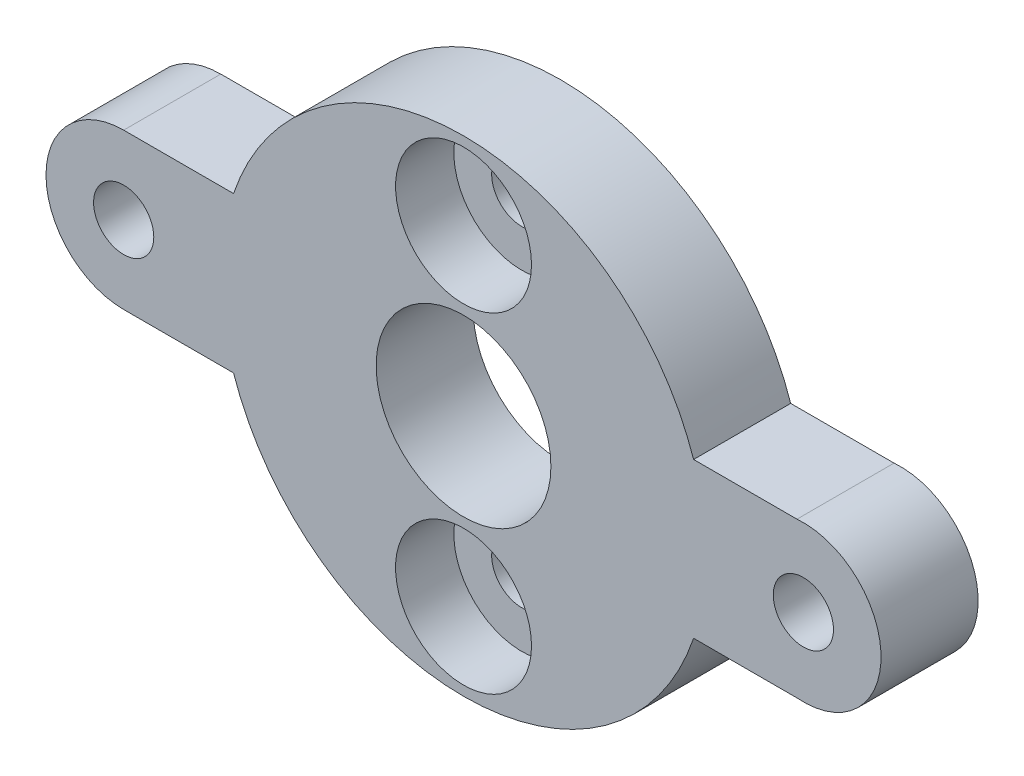
ISO-10303-21;
HEADER;
FILE_DESCRIPTION(('STEP AP214'),'2;1');
FILE_NAME('part.step','',(''),(''),'','','');
FILE_SCHEMA(('AUTOMOTIVE_DESIGN { 1 0 10303 214 1 1 1 1 }'));
ENDSEC;
DATA;
#1=APPLICATION_CONTEXT('core data for automotive mechanical design processes');
#2=APPLICATION_PROTOCOL_DEFINITION('international standard','automotive_design',2000,#1);
#3=PRODUCT_CONTEXT('',#1,'mechanical');
#4=PRODUCT('Part','Part','',(#3));
#5=PRODUCT_RELATED_PRODUCT_CATEGORY('part','',(#4));
#6=PRODUCT_DEFINITION_FORMATION('','',#4);
#7=PRODUCT_DEFINITION_CONTEXT('part definition',#1,'design');
#8=PRODUCT_DEFINITION('design','',#6,#7);
#9=PRODUCT_DEFINITION_SHAPE('','',#8);
#10=(LENGTH_UNIT() NAMED_UNIT(*) SI_UNIT(.MILLI.,.METRE.));
#11=(NAMED_UNIT(*) PLANE_ANGLE_UNIT() SI_UNIT($,.RADIAN.));
#12=(NAMED_UNIT(*) SI_UNIT($,.STERADIAN.) SOLID_ANGLE_UNIT());
#13=UNCERTAINTY_MEASURE_WITH_UNIT(LENGTH_MEASURE(1.E-05),#10,'distance_accuracy_value','');
#14=(GEOMETRIC_REPRESENTATION_CONTEXT(3) GLOBAL_UNCERTAINTY_ASSIGNED_CONTEXT((#13)) GLOBAL_UNIT_ASSIGNED_CONTEXT((#10,
#11,#12)) REPRESENTATION_CONTEXT('',''));
#15=CARTESIAN_POINT('',(0.,0.,0.));
#16=DIRECTION('',(0.,0.,1.));
#17=DIRECTION('',(1.,0.,0.));
#18=AXIS2_PLACEMENT_3D('',#15,#16,#17);
#19=CARTESIAN_POINT('',(0.,8.5,5.));
#20=DIRECTION('',(0.,0.,-1.));
#21=DIRECTION('',(-1.,0.,0.));
#22=AXIS2_PLACEMENT_3D('',#19,#20,#21);
#23=CYLINDRICAL_SURFACE('',#22,1.55);
#24=CARTESIAN_POINT('',(0.,8.5,0.));
#25=DIRECTION('',(0.,0.,1.));
#26=DIRECTION('',(1.,0.,0.));
#27=AXIS2_PLACEMENT_3D('',#24,#25,#26);
#28=CIRCLE('',#27,1.55);
#29=CARTESIAN_POINT('',(1.55,8.5,0.));
#30=VERTEX_POINT('',#29);
#31=EDGE_CURVE('E214',#30,#30,#28,.T.);
#32=ORIENTED_EDGE('',*,*,#31,.F.);
#33=EDGE_LOOP('',(#32));
#34=FACE_BOUND('',#33,.T.);
#35=CARTESIAN_POINT('',(0.,8.5,2.));
#36=DIRECTION('',(0.,0.,1.));
#37=DIRECTION('',(1.,0.,0.));
#38=AXIS2_PLACEMENT_3D('',#35,#36,#37);
#39=CIRCLE('',#38,1.55);
#40=CARTESIAN_POINT('',(1.55,8.5,2.));
#41=VERTEX_POINT('',#40);
#42=EDGE_CURVE('E43',#41,#41,#39,.T.);
#43=ORIENTED_EDGE('',*,*,#42,.T.);
#44=EDGE_LOOP('',(#43));
#45=FACE_BOUND('',#44,.T.);
#46=ADVANCED_FACE('F39',(#34,#45),#23,.F.);
#47=CARTESIAN_POINT('',(0.,-8.5,5.));
#48=DIRECTION('',(0.,0.,-1.));
#49=DIRECTION('',(-1.,0.,0.));
#50=AXIS2_PLACEMENT_3D('',#47,#48,#49);
#51=CYLINDRICAL_SURFACE('',#50,1.55);
#52=CARTESIAN_POINT('',(0.,-8.5,0.));
#53=DIRECTION('',(0.,0.,1.));
#54=DIRECTION('',(1.,0.,0.));
#55=AXIS2_PLACEMENT_3D('',#52,#53,#54);
#56=CIRCLE('',#55,1.55);
#57=CARTESIAN_POINT('',(1.55,-8.5,0.));
#58=VERTEX_POINT('',#57);
#59=EDGE_CURVE('E193',#58,#58,#56,.T.);
#60=ORIENTED_EDGE('',*,*,#59,.F.);
#61=EDGE_LOOP('',(#60));
#62=FACE_BOUND('',#61,.T.);
#63=CARTESIAN_POINT('',(0.,-8.5,2.));
#64=DIRECTION('',(0.,0.,1.));
#65=DIRECTION('',(1.,0.,0.));
#66=AXIS2_PLACEMENT_3D('',#63,#64,#65);
#67=CIRCLE('',#66,1.55);
#68=CARTESIAN_POINT('',(1.55,-8.5,2.));
#69=VERTEX_POINT('',#68);
#70=EDGE_CURVE('E184',#69,#69,#67,.T.);
#71=ORIENTED_EDGE('',*,*,#70,.T.);
#72=EDGE_LOOP('',(#71));
#73=FACE_BOUND('',#72,.T.);
#74=ADVANCED_FACE('F283',(#62,#73),#51,.F.);
#75=CARTESIAN_POINT('',(-17.5,0.,5.));
#76=DIRECTION('',(0.,0.,1.));
#77=DIRECTION('',(1.,0.,0.));
#78=AXIS2_PLACEMENT_3D('',#75,#76,#77);
#79=PLANE('',#78);
#80=CARTESIAN_POINT('',(0.,8.5,5.));
#81=DIRECTION('',(0.,0.,1.));
#82=DIRECTION('',(1.,0.,0.));
#83=AXIS2_PLACEMENT_3D('',#80,#81,#82);
#84=CIRCLE('',#83,3.5);
#85=CARTESIAN_POINT('',(3.5,8.5,5.));
#86=VERTEX_POINT('',#85);
#87=EDGE_CURVE('E195',#86,#86,#84,.T.);
#88=ORIENTED_EDGE('',*,*,#87,.F.);
#89=EDGE_LOOP('',(#88));
#90=FACE_BOUND('',#89,.T.);
#91=CARTESIAN_POINT('',(0.,-8.5,5.));
#92=DIRECTION('',(0.,0.,1.));
#93=DIRECTION('',(1.,0.,0.));
#94=AXIS2_PLACEMENT_3D('',#91,#92,#93);
#95=CIRCLE('',#94,3.5);
#96=CARTESIAN_POINT('',(3.5,-8.5,5.));
#97=VERTEX_POINT('',#96);
#98=EDGE_CURVE('E207',#97,#97,#95,.T.);
#99=ORIENTED_EDGE('',*,*,#98,.F.);
#100=EDGE_LOOP('',(#99));
#101=FACE_BOUND('',#100,.T.);
#102=CARTESIAN_POINT('',(17.5,0.,5.));
#103=DIRECTION('',(0.,0.,1.));
#104=DIRECTION('',(1.,0.,0.));
#105=AXIS2_PLACEMENT_3D('',#102,#103,#104);
#106=CIRCLE('',#105,1.55);
#107=CARTESIAN_POINT('',(19.05,0.,5.));
#108=VERTEX_POINT('',#107);
#109=EDGE_CURVE('E227',#108,#108,#106,.T.);
#110=ORIENTED_EDGE('',*,*,#109,.F.);
#111=EDGE_LOOP('',(#110));
#112=FACE_BOUND('',#111,.T.);
#113=CARTESIAN_POINT('',(-17.5,0.,5.));
#114=DIRECTION('',(0.,0.,1.));
#115=DIRECTION('',(1.,0.,0.));
#116=AXIS2_PLACEMENT_3D('',#113,#114,#115);
#117=CIRCLE('',#116,4.);
#118=CARTESIAN_POINT('',(-17.5,4.,5.));
#119=VERTEX_POINT('',#118);
#120=CARTESIAN_POINT('',(-17.5,-4.,5.));
#121=VERTEX_POINT('',#120);
#122=EDGE_CURVE('E167',#119,#121,#117,.T.);
#123=ORIENTED_EDGE('',*,*,#122,.T.);
#124=DIRECTION('',(1.,0.,0.));
#125=VECTOR('',#124,1.);
#126=CARTESIAN_POINT('',(-17.5,-4.,5.));
#127=LINE('',#126,#125);
#128=CARTESIAN_POINT('',(-11.842719282327,-4.,5.));
#129=VERTEX_POINT('',#128);
#130=EDGE_CURVE('E102',#121,#129,#127,.T.);
#131=ORIENTED_EDGE('',*,*,#130,.T.);
#132=CARTESIAN_POINT('',(0.,0.,5.));
#133=DIRECTION('',(0.,0.,1.));
#134=DIRECTION('',(1.,0.,0.));
#135=AXIS2_PLACEMENT_3D('',#132,#133,#134);
#136=CIRCLE('',#135,12.5);
#137=CARTESIAN_POINT('',(11.8473151678838,-3.98636718238932,5.));
#138=VERTEX_POINT('',#137);
#139=EDGE_CURVE('E245',#129,#138,#136,.T.);
#140=ORIENTED_EDGE('',*,*,#139,.T.);
#141=DIRECTION('',(1.,0.,0.));
#142=VECTOR('',#141,1.);
#143=CARTESIAN_POINT('',(17.1700353243612,-3.98636718238932,5.));
#144=LINE('',#143,#142);
#145=CARTESIAN_POINT('',(17.1700353243612,-3.98636718238932,5.));
#146=VERTEX_POINT('',#145);
#147=EDGE_CURVE('E248',#138,#146,#144,.T.);
#148=ORIENTED_EDGE('',*,*,#147,.T.);
#149=CARTESIAN_POINT('',(17.5,0.,5.));
#150=DIRECTION('',(0.,0.,1.));
#151=DIRECTION('',(-1.,0.,0.));
#152=AXIS2_PLACEMENT_3D('',#149,#150,#151);
#153=CIRCLE('',#152,4.);
#154=CARTESIAN_POINT('',(17.1700353243612,3.98636718238933,5.));
#155=VERTEX_POINT('',#154);
#156=EDGE_CURVE('E122',#146,#155,#153,.T.);
#157=ORIENTED_EDGE('',*,*,#156,.T.);
#158=DIRECTION('',(-1.,0.,0.));
#159=VECTOR('',#158,1.);
#160=CARTESIAN_POINT('',(17.1700353243612,3.98636718238933,5.));
#161=LINE('',#160,#159);
#162=CARTESIAN_POINT('',(11.8473151678838,3.98636718238933,5.));
#163=VERTEX_POINT('',#162);
#164=EDGE_CURVE('E115',#155,#163,#161,.T.);
#165=ORIENTED_EDGE('',*,*,#164,.T.);
#166=CARTESIAN_POINT('',(0.,0.,5.));
#167=DIRECTION('',(0.,0.,1.));
#168=DIRECTION('',(-1.,0.,0.));
#169=AXIS2_PLACEMENT_3D('',#166,#167,#168);
#170=CIRCLE('',#169,12.5);
#171=CARTESIAN_POINT('',(-11.842719282327,4.,5.));
#172=VERTEX_POINT('',#171);
#173=EDGE_CURVE('E120',#163,#172,#170,.T.);
#174=ORIENTED_EDGE('',*,*,#173,.T.);
#175=DIRECTION('',(-1.,0.,0.));
#176=VECTOR('',#175,1.);
#177=CARTESIAN_POINT('',(-17.5,4.,5.));
#178=LINE('',#177,#176);
#179=EDGE_CURVE('E59',#172,#119,#178,.T.);
#180=ORIENTED_EDGE('',*,*,#179,.T.);
#181=EDGE_LOOP('',(#123,#131,#140,#148,#157,#165,#174,#180));
#182=FACE_BOUND('',#181,.T.);
#183=CARTESIAN_POINT('',(-17.5,0.,5.));
#184=DIRECTION('',(0.,0.,1.));
#185=DIRECTION('',(1.,0.,0.));
#186=AXIS2_PLACEMENT_3D('',#183,#184,#185);
#187=CIRCLE('',#186,1.55);
#188=CARTESIAN_POINT('',(-15.95,0.,5.));
#189=VERTEX_POINT('',#188);
#190=EDGE_CURVE('E149',#189,#189,#187,.T.);
#191=ORIENTED_EDGE('',*,*,#190,.F.);
#192=EDGE_LOOP('',(#191));
#193=FACE_BOUND('',#192,.T.);
#194=CARTESIAN_POINT('',(0.,0.,5.));
#195=DIRECTION('',(0.,0.,1.));
#196=DIRECTION('',(1.,0.,0.));
#197=AXIS2_PLACEMENT_3D('',#194,#195,#196);
#198=CIRCLE('',#197,4.5);
#199=CARTESIAN_POINT('',(4.5,0.,5.));
#200=VERTEX_POINT('',#199);
#201=EDGE_CURVE('E219',#200,#200,#198,.T.);
#202=ORIENTED_EDGE('',*,*,#201,.F.);
#203=EDGE_LOOP('',(#202));
#204=FACE_BOUND('',#203,.T.);
#205=ADVANCED_FACE('F117',(#90,#101,#112,#182,#193,#204),#79,.T.);
#206=CARTESIAN_POINT('',(-17.5,0.,0.));
#207=DIRECTION('',(0.,0.,1.));
#208=DIRECTION('',(1.,0.,0.));
#209=AXIS2_PLACEMENT_3D('',#206,#207,#208);
#210=PLANE('',#209);
#211=CARTESIAN_POINT('',(-17.5,0.,0.));
#212=DIRECTION('',(0.,0.,1.));
#213=DIRECTION('',(1.,0.,0.));
#214=AXIS2_PLACEMENT_3D('',#211,#212,#213);
#215=CIRCLE('',#214,4.);
#216=CARTESIAN_POINT('',(-17.5,4.,0.));
#217=VERTEX_POINT('',#216);
#218=CARTESIAN_POINT('',(-17.5,-4.,0.));
#219=VERTEX_POINT('',#218);
#220=EDGE_CURVE('E144',#217,#219,#215,.T.);
#221=ORIENTED_EDGE('',*,*,#220,.F.);
#222=DIRECTION('',(-1.,0.,0.));
#223=VECTOR('',#222,1.);
#224=CARTESIAN_POINT('',(-17.5,4.,0.));
#225=LINE('',#224,#223);
#226=CARTESIAN_POINT('',(-11.842719282327,4.,0.));
#227=VERTEX_POINT('',#226);
#228=EDGE_CURVE('E94',#227,#217,#225,.T.);
#229=ORIENTED_EDGE('',*,*,#228,.F.);
#230=CARTESIAN_POINT('',(0.,0.,0.));
#231=DIRECTION('',(0.,0.,1.));
#232=DIRECTION('',(-1.,0.,0.));
#233=AXIS2_PLACEMENT_3D('',#230,#231,#232);
#234=CIRCLE('',#233,12.5);
#235=CARTESIAN_POINT('',(11.8473151678838,3.98636718238933,0.));
#236=VERTEX_POINT('',#235);
#237=EDGE_CURVE('E88',#236,#227,#234,.T.);
#238=ORIENTED_EDGE('',*,*,#237,.F.);
#239=DIRECTION('',(-1.,0.,0.));
#240=VECTOR('',#239,1.);
#241=CARTESIAN_POINT('',(17.1700353243612,3.98636718238933,0.));
#242=LINE('',#241,#240);
#243=CARTESIAN_POINT('',(17.1700353243612,3.98636718238933,0.));
#244=VERTEX_POINT('',#243);
#245=EDGE_CURVE('E131',#244,#236,#242,.T.);
#246=ORIENTED_EDGE('',*,*,#245,.F.);
#247=CARTESIAN_POINT('',(17.5,0.,0.));
#248=DIRECTION('',(0.,0.,1.));
#249=DIRECTION('',(-1.,0.,0.));
#250=AXIS2_PLACEMENT_3D('',#247,#248,#249);
#251=CIRCLE('',#250,4.);
#252=CARTESIAN_POINT('',(17.1700353243612,-3.98636718238932,0.));
#253=VERTEX_POINT('',#252);
#254=EDGE_CURVE('E158',#253,#244,#251,.T.);
#255=ORIENTED_EDGE('',*,*,#254,.F.);
#256=DIRECTION('',(1.,0.,0.));
#257=VECTOR('',#256,1.);
#258=CARTESIAN_POINT('',(17.1700353243612,-3.98636718238932,0.));
#259=LINE('',#258,#257);
#260=CARTESIAN_POINT('',(11.8473151678838,-3.98636718238932,0.));
#261=VERTEX_POINT('',#260);
#262=EDGE_CURVE('E155',#261,#253,#259,.T.);
#263=ORIENTED_EDGE('',*,*,#262,.F.);
#264=CARTESIAN_POINT('',(0.,0.,0.));
#265=DIRECTION('',(0.,0.,1.));
#266=DIRECTION('',(1.,0.,0.));
#267=AXIS2_PLACEMENT_3D('',#264,#265,#266);
#268=CIRCLE('',#267,12.5);
#269=CARTESIAN_POINT('',(-11.842719282327,-4.,0.));
#270=VERTEX_POINT('',#269);
#271=EDGE_CURVE('E152',#270,#261,#268,.T.);
#272=ORIENTED_EDGE('',*,*,#271,.F.);
#273=DIRECTION('',(1.,0.,0.));
#274=VECTOR('',#273,1.);
#275=CARTESIAN_POINT('',(-17.5,-4.,0.));
#276=LINE('',#275,#274);
#277=EDGE_CURVE('E148',#219,#270,#276,.T.);
#278=ORIENTED_EDGE('',*,*,#277,.F.);
#279=EDGE_LOOP('',(#221,#229,#238,#246,#255,#263,#272,#278));
#280=FACE_BOUND('',#279,.T.);
#281=CARTESIAN_POINT('',(-17.5,0.,0.));
#282=DIRECTION('',(0.,0.,1.));
#283=DIRECTION('',(1.,0.,0.));
#284=AXIS2_PLACEMENT_3D('',#281,#282,#283);
#285=CIRCLE('',#284,1.55);
#286=CARTESIAN_POINT('',(-15.95,0.,0.));
#287=VERTEX_POINT('',#286);
#288=EDGE_CURVE('E231',#287,#287,#285,.T.);
#289=ORIENTED_EDGE('',*,*,#288,.T.);
#290=EDGE_LOOP('',(#289));
#291=FACE_BOUND('',#290,.T.);
#292=CARTESIAN_POINT('',(17.5,0.,0.));
#293=DIRECTION('',(0.,0.,1.));
#294=DIRECTION('',(1.,0.,0.));
#295=AXIS2_PLACEMENT_3D('',#292,#293,#294);
#296=CIRCLE('',#295,1.55);
#297=CARTESIAN_POINT('',(19.05,0.,0.));
#298=VERTEX_POINT('',#297);
#299=EDGE_CURVE('E223',#298,#298,#296,.T.);
#300=ORIENTED_EDGE('',*,*,#299,.T.);
#301=EDGE_LOOP('',(#300));
#302=FACE_BOUND('',#301,.T.);
#303=CARTESIAN_POINT('',(0.,0.,0.));
#304=DIRECTION('',(0.,0.,1.));
#305=DIRECTION('',(1.,0.,0.));
#306=AXIS2_PLACEMENT_3D('',#303,#304,#305);
#307=CIRCLE('',#306,4.5);
#308=CARTESIAN_POINT('',(4.5,0.,0.));
#309=VERTEX_POINT('',#308);
#310=EDGE_CURVE('E218',#309,#309,#307,.T.);
#311=ORIENTED_EDGE('',*,*,#310,.T.);
#312=EDGE_LOOP('',(#311));
#313=FACE_BOUND('',#312,.T.);
#314=ORIENTED_EDGE('',*,*,#31,.T.);
#315=EDGE_LOOP('',(#314));
#316=FACE_BOUND('',#315,.T.);
#317=ORIENTED_EDGE('',*,*,#59,.T.);
#318=EDGE_LOOP('',(#317));
#319=FACE_BOUND('',#318,.T.);
#320=ADVANCED_FACE('F263',(#280,#291,#302,#313,#316,#319),#210,.F.);
#321=CARTESIAN_POINT('',(-17.5,0.,5.));
#322=DIRECTION('',(0.,0.,-1.));
#323=DIRECTION('',(-1.,0.,0.));
#324=AXIS2_PLACEMENT_3D('',#321,#322,#323);
#325=CYLINDRICAL_SURFACE('',#324,4.);
#326=ORIENTED_EDGE('',*,*,#220,.T.);
#327=DIRECTION('',(0.,0.,-1.));
#328=VECTOR('',#327,1.);
#329=CARTESIAN_POINT('',(-17.5,-4.,5.));
#330=LINE('',#329,#328);
#331=EDGE_CURVE('E11',#121,#219,#330,.T.);
#332=ORIENTED_EDGE('',*,*,#331,.F.);
#333=ORIENTED_EDGE('',*,*,#122,.F.);
#334=DIRECTION('',(0.,0.,-1.));
#335=VECTOR('',#334,1.);
#336=CARTESIAN_POINT('',(-17.5,4.,5.));
#337=LINE('',#336,#335);
#338=EDGE_CURVE('E140',#119,#217,#337,.T.);
#339=ORIENTED_EDGE('',*,*,#338,.T.);
#340=EDGE_LOOP('',(#326,#332,#333,#339));
#341=FACE_BOUND('',#340,.T.);
#342=ADVANCED_FACE('F41',(#341),#325,.T.);
#343=CARTESIAN_POINT('',(-17.5,-4.,5.));
#344=DIRECTION('',(0.,1.,0.));
#345=DIRECTION('',(0.,0.,1.));
#346=AXIS2_PLACEMENT_3D('',#343,#344,#345);
#347=PLANE('',#346);
#348=ORIENTED_EDGE('',*,*,#277,.T.);
#349=DIRECTION('',(0.,0.,-1.));
#350=VECTOR('',#349,1.);
#351=CARTESIAN_POINT('',(-11.842719282327,-4.,5.));
#352=LINE('',#351,#350);
#353=EDGE_CURVE('E50',#129,#270,#352,.T.);
#354=ORIENTED_EDGE('',*,*,#353,.F.);
#355=ORIENTED_EDGE('',*,*,#130,.F.);
#356=ORIENTED_EDGE('',*,*,#331,.T.);
#357=EDGE_LOOP('',(#348,#354,#355,#356));
#358=FACE_BOUND('',#357,.T.);
#359=ADVANCED_FACE('F309',(#358),#347,.F.);
#360=CARTESIAN_POINT('',(0.,0.,5.));
#361=DIRECTION('',(0.,0.,-1.));
#362=DIRECTION('',(-1.,0.,0.));
#363=AXIS2_PLACEMENT_3D('',#360,#361,#362);
#364=CYLINDRICAL_SURFACE('',#363,12.5);
#365=ORIENTED_EDGE('',*,*,#271,.T.);
#366=DIRECTION('',(0.,0.,-1.));
#367=VECTOR('',#366,1.);
#368=CARTESIAN_POINT('',(11.8473151678838,-3.98636718238932,5.));
#369=LINE('',#368,#367);
#370=EDGE_CURVE('E178',#138,#261,#369,.T.);
#371=ORIENTED_EDGE('',*,*,#370,.F.);
#372=ORIENTED_EDGE('',*,*,#139,.F.);
#373=ORIENTED_EDGE('',*,*,#353,.T.);
#374=EDGE_LOOP('',(#365,#371,#372,#373));
#375=FACE_BOUND('',#374,.T.);
#376=ADVANCED_FACE('F313',(#375),#364,.T.);
#377=CARTESIAN_POINT('',(17.1700353243612,-3.98636718238932,5.));
#378=DIRECTION('',(0.,1.,0.));
#379=DIRECTION('',(0.,0.,1.));
#380=AXIS2_PLACEMENT_3D('',#377,#378,#379);
#381=PLANE('',#380);
#382=ORIENTED_EDGE('',*,*,#262,.T.);
#383=DIRECTION('',(0.,0.,-1.));
#384=VECTOR('',#383,1.);
#385=CARTESIAN_POINT('',(17.1700353243612,-3.98636718238932,5.));
#386=LINE('',#385,#384);
#387=EDGE_CURVE('E174',#146,#253,#386,.T.);
#388=ORIENTED_EDGE('',*,*,#387,.F.);
#389=ORIENTED_EDGE('',*,*,#147,.F.);
#390=ORIENTED_EDGE('',*,*,#370,.T.);
#391=EDGE_LOOP('',(#382,#388,#389,#390));
#392=FACE_BOUND('',#391,.T.);
#393=ADVANCED_FACE('F256',(#392),#381,.F.);
#394=CARTESIAN_POINT('',(17.5,0.,5.));
#395=DIRECTION('',(0.,0.,-1.));
#396=DIRECTION('',(-1.,0.,0.));
#397=AXIS2_PLACEMENT_3D('',#394,#395,#396);
#398=CYLINDRICAL_SURFACE('',#397,4.);
#399=ORIENTED_EDGE('',*,*,#254,.T.);
#400=DIRECTION('',(0.,0.,-1.));
#401=VECTOR('',#400,1.);
#402=CARTESIAN_POINT('',(17.1700353243612,3.98636718238933,5.));
#403=LINE('',#402,#401);
#404=EDGE_CURVE('E133',#155,#244,#403,.T.);
#405=ORIENTED_EDGE('',*,*,#404,.F.);
#406=ORIENTED_EDGE('',*,*,#156,.F.);
#407=ORIENTED_EDGE('',*,*,#387,.T.);
#408=EDGE_LOOP('',(#399,#405,#406,#407));
#409=FACE_BOUND('',#408,.T.);
#410=ADVANCED_FACE('F260',(#409),#398,.T.);
#411=CARTESIAN_POINT('',(17.1700353243612,3.98636718238933,5.));
#412=DIRECTION('',(0.,-1.,0.));
#413=DIRECTION('',(1.,0.,0.));
#414=AXIS2_PLACEMENT_3D('',#411,#412,#413);
#415=PLANE('',#414);
#416=ORIENTED_EDGE('',*,*,#245,.T.);
#417=DIRECTION('',(0.,0.,-1.));
#418=VECTOR('',#417,1.);
#419=CARTESIAN_POINT('',(11.8473151678838,3.98636718238933,5.));
#420=LINE('',#419,#418);
#421=EDGE_CURVE('E128',#163,#236,#420,.T.);
#422=ORIENTED_EDGE('',*,*,#421,.F.);
#423=ORIENTED_EDGE('',*,*,#164,.F.);
#424=ORIENTED_EDGE('',*,*,#404,.T.);
#425=EDGE_LOOP('',(#416,#422,#423,#424));
#426=FACE_BOUND('',#425,.T.);
#427=ADVANCED_FACE('F129',(#426),#415,.F.);
#428=CARTESIAN_POINT('',(0.,0.,5.));
#429=DIRECTION('',(0.,0.,-1.));
#430=DIRECTION('',(-1.,0.,0.));
#431=AXIS2_PLACEMENT_3D('',#428,#429,#430);
#432=CYLINDRICAL_SURFACE('',#431,12.5);
#433=ORIENTED_EDGE('',*,*,#237,.T.);
#434=DIRECTION('',(0.,0.,-1.));
#435=VECTOR('',#434,1.);
#436=CARTESIAN_POINT('',(-11.842719282327,4.,5.));
#437=LINE('',#436,#435);
#438=EDGE_CURVE('E134',#172,#227,#437,.T.);
#439=ORIENTED_EDGE('',*,*,#438,.F.);
#440=ORIENTED_EDGE('',*,*,#173,.F.);
#441=ORIENTED_EDGE('',*,*,#421,.T.);
#442=EDGE_LOOP('',(#433,#439,#440,#441));
#443=FACE_BOUND('',#442,.T.);
#444=ADVANCED_FACE('F136',(#443),#432,.T.);
#445=CARTESIAN_POINT('',(-17.5,4.,5.));
#446=DIRECTION('',(0.,-1.,0.));
#447=DIRECTION('',(0.,0.,-1.));
#448=AXIS2_PLACEMENT_3D('',#445,#446,#447);
#449=PLANE('',#448);
#450=ORIENTED_EDGE('',*,*,#228,.T.);
#451=ORIENTED_EDGE('',*,*,#338,.F.);
#452=ORIENTED_EDGE('',*,*,#179,.F.);
#453=ORIENTED_EDGE('',*,*,#438,.T.);
#454=EDGE_LOOP('',(#450,#451,#452,#453));
#455=FACE_BOUND('',#454,.T.);
#456=ADVANCED_FACE('F269',(#455),#449,.F.);
#457=CARTESIAN_POINT('',(-17.5,0.,5.));
#458=DIRECTION('',(0.,0.,-1.));
#459=DIRECTION('',(-1.,0.,0.));
#460=AXIS2_PLACEMENT_3D('',#457,#458,#459);
#461=CYLINDRICAL_SURFACE('',#460,1.55);
#462=ORIENTED_EDGE('',*,*,#190,.T.);
#463=EDGE_LOOP('',(#462));
#464=FACE_BOUND('',#463,.T.);
#465=ORIENTED_EDGE('',*,*,#288,.F.);
#466=EDGE_LOOP('',(#465));
#467=FACE_BOUND('',#466,.T.);
#468=ADVANCED_FACE('F271',(#464,#467),#461,.F.);
#469=CARTESIAN_POINT('',(17.5,0.,5.));
#470=DIRECTION('',(0.,0.,-1.));
#471=DIRECTION('',(-1.,0.,0.));
#472=AXIS2_PLACEMENT_3D('',#469,#470,#471);
#473=CYLINDRICAL_SURFACE('',#472,1.55);
#474=ORIENTED_EDGE('',*,*,#109,.T.);
#475=EDGE_LOOP('',(#474));
#476=FACE_BOUND('',#475,.T.);
#477=ORIENTED_EDGE('',*,*,#299,.F.);
#478=EDGE_LOOP('',(#477));
#479=FACE_BOUND('',#478,.T.);
#480=ADVANCED_FACE('F277',(#476,#479),#473,.F.);
#481=CARTESIAN_POINT('',(0.,0.,5.));
#482=DIRECTION('',(0.,0.,-1.));
#483=DIRECTION('',(-1.,0.,0.));
#484=AXIS2_PLACEMENT_3D('',#481,#482,#483);
#485=CYLINDRICAL_SURFACE('',#484,4.5);
#486=ORIENTED_EDGE('',*,*,#201,.T.);
#487=EDGE_LOOP('',(#486));
#488=FACE_BOUND('',#487,.T.);
#489=ORIENTED_EDGE('',*,*,#310,.F.);
#490=EDGE_LOOP('',(#489));
#491=FACE_BOUND('',#490,.T.);
#492=ADVANCED_FACE('F295',(#488,#491),#485,.F.);
#493=CARTESIAN_POINT('',(0.,-8.5,2.));
#494=DIRECTION('',(0.,0.,1.));
#495=DIRECTION('',(1.,0.,0.));
#496=AXIS2_PLACEMENT_3D('',#493,#494,#495);
#497=CYLINDRICAL_SURFACE('',#496,3.5);
#498=CARTESIAN_POINT('',(0.,-8.5,2.));
#499=DIRECTION('',(0.,0.,1.));
#500=DIRECTION('',(1.,0.,0.));
#501=AXIS2_PLACEMENT_3D('',#498,#499,#500);
#502=CIRCLE('',#501,3.5);
#503=CARTESIAN_POINT('',(3.5,-8.5,2.));
#504=VERTEX_POINT('',#503);
#505=EDGE_CURVE('E201',#504,#504,#502,.T.);
#506=ORIENTED_EDGE('',*,*,#505,.F.);
#507=EDGE_LOOP('',(#506));
#508=FACE_BOUND('',#507,.T.);
#509=ORIENTED_EDGE('',*,*,#98,.T.);
#510=EDGE_LOOP('',(#509));
#511=FACE_BOUND('',#510,.T.);
#512=ADVANCED_FACE('F298',(#508,#511),#497,.F.);
#513=CARTESIAN_POINT('',(0.,-8.5,2.));
#514=DIRECTION('',(0.,0.,1.));
#515=DIRECTION('',(1.,0.,0.));
#516=AXIS2_PLACEMENT_3D('',#513,#514,#515);
#517=PLANE('',#516);
#518=ORIENTED_EDGE('',*,*,#70,.F.);
#519=EDGE_LOOP('',(#518));
#520=FACE_BOUND('',#519,.T.);
#521=ORIENTED_EDGE('',*,*,#505,.T.);
#522=EDGE_LOOP('',(#521));
#523=FACE_BOUND('',#522,.T.);
#524=ADVANCED_FACE('F381',(#520,#523),#517,.T.);
#525=CARTESIAN_POINT('',(0.,8.5,2.));
#526=DIRECTION('',(0.,0.,1.));
#527=DIRECTION('',(1.,0.,0.));
#528=AXIS2_PLACEMENT_3D('',#525,#526,#527);
#529=CYLINDRICAL_SURFACE('',#528,3.5);
#530=CARTESIAN_POINT('',(0.,8.5,2.));
#531=DIRECTION('',(0.,0.,1.));
#532=DIRECTION('',(1.,0.,0.));
#533=AXIS2_PLACEMENT_3D('',#530,#531,#532);
#534=CIRCLE('',#533,3.5);
#535=CARTESIAN_POINT('',(3.5,8.5,2.));
#536=VERTEX_POINT('',#535);
#537=EDGE_CURVE('E187',#536,#536,#534,.T.);
#538=ORIENTED_EDGE('',*,*,#537,.F.);
#539=EDGE_LOOP('',(#538));
#540=FACE_BOUND('',#539,.T.);
#541=ORIENTED_EDGE('',*,*,#87,.T.);
#542=EDGE_LOOP('',(#541));
#543=FACE_BOUND('',#542,.T.);
#544=ADVANCED_FACE('F390',(#540,#543),#529,.F.);
#545=CARTESIAN_POINT('',(0.,8.5,2.));
#546=DIRECTION('',(0.,0.,1.));
#547=DIRECTION('',(1.,0.,0.));
#548=AXIS2_PLACEMENT_3D('',#545,#546,#547);
#549=PLANE('',#548);
#550=ORIENTED_EDGE('',*,*,#42,.F.);
#551=EDGE_LOOP('',(#550));
#552=FACE_BOUND('',#551,.T.);
#553=ORIENTED_EDGE('',*,*,#537,.T.);
#554=EDGE_LOOP('',(#553));
#555=FACE_BOUND('',#554,.T.);
#556=ADVANCED_FACE('F400',(#552,#555),#549,.T.);
#557=CLOSED_SHELL('',(#46,#74,#205,#320,#342,#359,#376,#393,#410,#427,#444,#456,#468,#480,#492,
#512,#524,#544,#556));
#558=MANIFOLD_SOLID_BREP('B2',#557);
#559=ADVANCED_BREP_SHAPE_REPRESENTATION('',(#18,#558),#14);
#560=SHAPE_DEFINITION_REPRESENTATION(#9,#559);
ENDSEC;
END-ISO-10303-21;
